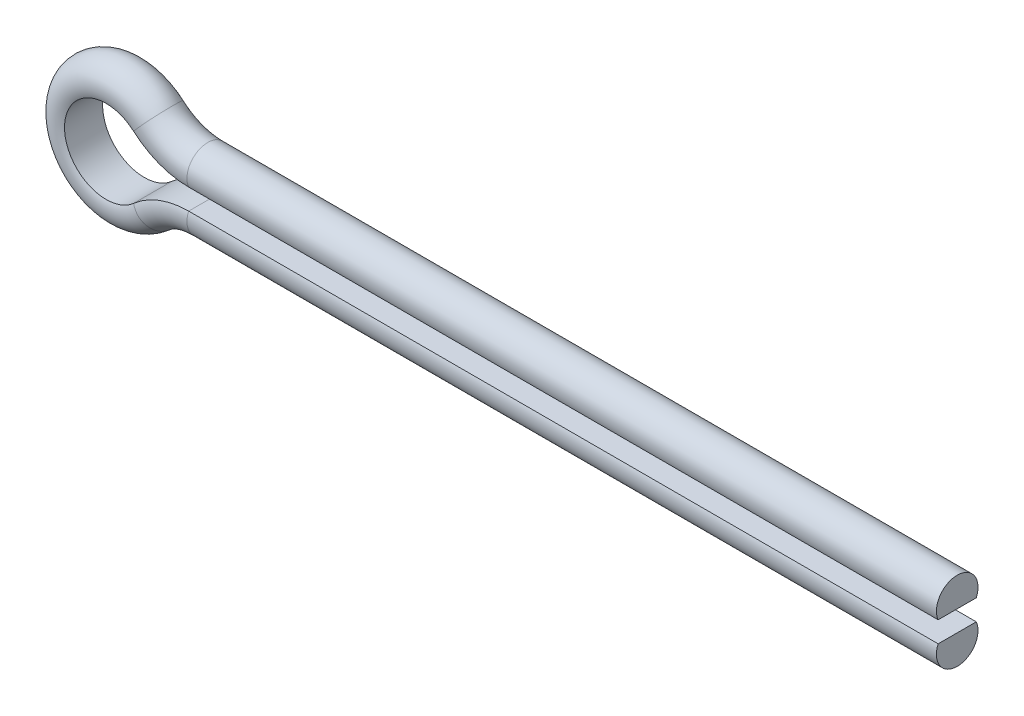
ISO-10303-21;
HEADER;
FILE_DESCRIPTION(('STEP AP214'),'2;1');
FILE_NAME('part.step','',(''),(''),'','','');
FILE_SCHEMA(('AUTOMOTIVE_DESIGN { 1 0 10303 214 1 1 1 1 }'));
ENDSEC;
DATA;
#1=APPLICATION_CONTEXT('core data for automotive mechanical design processes');
#2=APPLICATION_PROTOCOL_DEFINITION('international standard','automotive_design',2000,#1);
#3=PRODUCT_CONTEXT('',#1,'mechanical');
#4=PRODUCT('Part','Part','',(#3));
#5=PRODUCT_RELATED_PRODUCT_CATEGORY('part','',(#4));
#6=PRODUCT_DEFINITION_FORMATION('','',#4);
#7=PRODUCT_DEFINITION_CONTEXT('part definition',#1,'design');
#8=PRODUCT_DEFINITION('design','',#6,#7);
#9=PRODUCT_DEFINITION_SHAPE('','',#8);
#10=(LENGTH_UNIT() NAMED_UNIT(*) SI_UNIT(.MILLI.,.METRE.));
#11=(NAMED_UNIT(*) PLANE_ANGLE_UNIT() SI_UNIT($,.RADIAN.));
#12=(NAMED_UNIT(*) SI_UNIT($,.STERADIAN.) SOLID_ANGLE_UNIT());
#13=UNCERTAINTY_MEASURE_WITH_UNIT(LENGTH_MEASURE(1.E-05),#10,'distance_accuracy_value','');
#14=(GEOMETRIC_REPRESENTATION_CONTEXT(3) GLOBAL_UNCERTAINTY_ASSIGNED_CONTEXT((#13)) GLOBAL_UNIT_ASSIGNED_CONTEXT((#10,
#11,#12)) REPRESENTATION_CONTEXT('',''));
#15=CARTESIAN_POINT('',(0.,0.,0.));
#16=DIRECTION('',(0.,0.,1.));
#17=DIRECTION('',(1.,0.,0.));
#18=AXIS2_PLACEMENT_3D('',#15,#16,#17);
#19=CARTESIAN_POINT('',(100.,2.25,0.));
#20=DIRECTION('',(-1.,0.,0.));
#21=DIRECTION('',(0.,0.,-1.));
#22=AXIS2_PLACEMENT_3D('',#19,#20,#21);
#23=PLANE('',#22);
#24=CARTESIAN_POINT('',(100.,2.25,0.));
#25=DIRECTION('',(-1.,0.,0.));
#26=DIRECTION('',(0.,0.,-1.));
#27=AXIS2_PLACEMENT_3D('',#24,#25,#26);
#28=CIRCLE('',#27,2.5);
#29=CARTESIAN_POINT('',(100.,1.25,2.29128784747792));
#30=VERTEX_POINT('',#29);
#31=CARTESIAN_POINT('',(100.,1.25,-2.29128784747792));
#32=VERTEX_POINT('',#31);
#33=EDGE_CURVE('E79',#30,#32,#28,.T.);
#34=ORIENTED_EDGE('',*,*,#33,.F.);
#35=DIRECTION('',(0.,0.,1.));
#36=VECTOR('',#35,1.);
#37=CARTESIAN_POINT('',(100.,1.25,2.29128784747792));
#38=LINE('',#37,#36);
#39=EDGE_CURVE('E81',#32,#30,#38,.T.);
#40=ORIENTED_EDGE('',*,*,#39,.F.);
#41=EDGE_LOOP('',(#34,#40));
#42=FACE_BOUND('',#41,.T.);
#43=ADVANCED_FACE('F33',(#42),#23,.F.);
#44=CARTESIAN_POINT('',(100.,-2.25,0.));
#45=DIRECTION('',(1.,0.,0.));
#46=DIRECTION('',(0.,0.,-1.));
#47=AXIS2_PLACEMENT_3D('',#44,#45,#46);
#48=PLANE('',#47);
#49=CARTESIAN_POINT('',(100.,-2.25,0.));
#50=DIRECTION('',(1.,0.,0.));
#51=DIRECTION('',(0.,0.,-1.));
#52=AXIS2_PLACEMENT_3D('',#49,#50,#51);
#53=CIRCLE('',#52,2.5);
#54=CARTESIAN_POINT('',(100.,-1.25,2.29128784747792));
#55=VERTEX_POINT('',#54);
#56=CARTESIAN_POINT('',(100.,-1.25,-2.29128784747792));
#57=VERTEX_POINT('',#56);
#58=EDGE_CURVE('E45',#55,#57,#53,.T.);
#59=ORIENTED_EDGE('',*,*,#58,.T.);
#60=DIRECTION('',(0.,0.,1.));
#61=VECTOR('',#60,1.);
#62=CARTESIAN_POINT('',(100.,-1.25,2.29128784747792));
#63=LINE('',#62,#61);
#64=EDGE_CURVE('E11',#57,#55,#63,.T.);
#65=ORIENTED_EDGE('',*,*,#64,.T.);
#66=EDGE_LOOP('',(#59,#65));
#67=FACE_BOUND('',#66,.T.);
#68=ADVANCED_FACE('F184',(#67),#48,.T.);
#69=CARTESIAN_POINT('',(100.,2.25,0.));
#70=DIRECTION('',(-1.,0.,0.));
#71=DIRECTION('',(0.,-1.,0.));
#72=AXIS2_PLACEMENT_3D('',#69,#70,#71);
#73=CYLINDRICAL_SURFACE('',#72,2.5);
#74=DIRECTION('',(-1.,0.,0.));
#75=VECTOR('',#74,1.);
#76=CARTESIAN_POINT('',(100.,1.25,-2.29128784747792));
#77=LINE('',#76,#75);
#78=CARTESIAN_POINT('',(9.92156741649221,1.25,-2.29128784747792));
#79=VERTEX_POINT('',#78);
#80=EDGE_CURVE('E92',#32,#79,#77,.T.);
#81=ORIENTED_EDGE('',*,*,#80,.T.);
#82=CARTESIAN_POINT('',(9.92156741649221,2.25,0.));
#83=DIRECTION('',(-1.,0.,0.));
#84=DIRECTION('',(0.,0.,-1.));
#85=AXIS2_PLACEMENT_3D('',#82,#83,#84);
#86=CIRCLE('',#85,2.5);
#87=CARTESIAN_POINT('',(9.92156741649221,1.25,2.29128784747792));
#88=VERTEX_POINT('',#87);
#89=EDGE_CURVE('E97',#88,#79,#86,.T.);
#90=ORIENTED_EDGE('',*,*,#89,.F.);
#91=DIRECTION('',(-1.,0.,0.));
#92=VECTOR('',#91,1.);
#93=CARTESIAN_POINT('',(100.,1.25,2.29128784747792));
#94=LINE('',#93,#92);
#95=EDGE_CURVE('E91',#30,#88,#94,.T.);
#96=ORIENTED_EDGE('',*,*,#95,.F.);
#97=ORIENTED_EDGE('',*,*,#33,.T.);
#98=EDGE_LOOP('',(#81,#90,#96,#97));
#99=FACE_BOUND('',#98,.T.);
#100=ADVANCED_FACE('F95',(#99),#73,.T.);
#101=CARTESIAN_POINT('',(100.,1.25,2.29128784747792));
#102=DIRECTION('',(0.,-1.,0.));
#103=DIRECTION('',(0.,0.,-1.));
#104=AXIS2_PLACEMENT_3D('',#101,#102,#103);
#105=PLANE('',#104);
#106=DIRECTION('',(0.,0.,1.));
#107=VECTOR('',#106,1.);
#108=CARTESIAN_POINT('',(9.92156741649221,1.25,2.29128784747792));
#109=LINE('',#108,#107);
#110=EDGE_CURVE('E112',#79,#88,#109,.T.);
#111=ORIENTED_EDGE('',*,*,#110,.F.);
#112=ORIENTED_EDGE('',*,*,#80,.F.);
#113=ORIENTED_EDGE('',*,*,#39,.T.);
#114=ORIENTED_EDGE('',*,*,#95,.T.);
#115=EDGE_LOOP('',(#111,#112,#113,#114));
#116=FACE_BOUND('',#115,.T.);
#117=ADVANCED_FACE('F90',(#116),#105,.T.);
#118=CARTESIAN_POINT('',(9.9215674164922,11.25,0.));
#119=DIRECTION('',(0.,0.,-1.));
#120=DIRECTION('',(-1.,0.,0.));
#121=AXIS2_PLACEMENT_3D('',#118,#119,#120);
#122=TOROIDAL_SURFACE('',#121,8.99999999999999,2.5);
#123=CARTESIAN_POINT('',(9.9215674164922,11.25,-2.29128784747792));
#124=DIRECTION('',(0.,0.,-1.));
#125=DIRECTION('',(0.,-1.,0.));
#126=AXIS2_PLACEMENT_3D('',#123,#124,#125);
#127=CIRCLE('',#126,9.99999999999999);
#128=CARTESIAN_POINT('',(3.30718913883073,3.75,-2.29128784747792));
#129=VERTEX_POINT('',#128);
#130=EDGE_CURVE('E105',#79,#129,#127,.T.);
#131=ORIENTED_EDGE('',*,*,#130,.T.);
#132=CARTESIAN_POINT('',(3.96862696659687,4.5,0.));
#133=DIRECTION('',(-0.75,0.661437827766148,0.));
#134=DIRECTION('',(0.,0.,-1.));
#135=AXIS2_PLACEMENT_3D('',#132,#133,#134);
#136=CIRCLE('',#135,2.5);
#137=CARTESIAN_POINT('',(3.30718913883073,3.75,2.29128784747792));
#138=VERTEX_POINT('',#137);
#139=EDGE_CURVE('E102',#138,#129,#136,.T.);
#140=ORIENTED_EDGE('',*,*,#139,.F.);
#141=CARTESIAN_POINT('',(9.9215674164922,11.25,2.29128784747792));
#142=DIRECTION('',(0.,0.,-1.));
#143=DIRECTION('',(0.,-1.,0.));
#144=AXIS2_PLACEMENT_3D('',#141,#142,#143);
#145=CIRCLE('',#144,9.99999999999999);
#146=EDGE_CURVE('E106',#88,#138,#145,.T.);
#147=ORIENTED_EDGE('',*,*,#146,.F.);
#148=ORIENTED_EDGE('',*,*,#89,.T.);
#149=EDGE_LOOP('',(#131,#140,#147,#148));
#150=FACE_BOUND('',#149,.T.);
#151=ADVANCED_FACE('F164',(#150),#122,.T.);
#152=CARTESIAN_POINT('',(9.9215674164922,11.25,0.));
#153=DIRECTION('',(0.,0.,-1.));
#154=DIRECTION('',(-1.,0.,0.));
#155=AXIS2_PLACEMENT_3D('',#152,#153,#154);
#156=CYLINDRICAL_SURFACE('',#155,9.99999999999999);
#157=DIRECTION('',(0.,0.,1.));
#158=VECTOR('',#157,1.);
#159=CARTESIAN_POINT('',(3.30718913883073,3.75,2.29128784747792));
#160=LINE('',#159,#158);
#161=EDGE_CURVE('E109',#129,#138,#160,.T.);
#162=ORIENTED_EDGE('',*,*,#161,.F.);
#163=ORIENTED_EDGE('',*,*,#130,.F.);
#164=ORIENTED_EDGE('',*,*,#110,.T.);
#165=ORIENTED_EDGE('',*,*,#146,.T.);
#166=EDGE_LOOP('',(#162,#163,#164,#165));
#167=FACE_BOUND('',#166,.T.);
#168=ADVANCED_FACE('F165',(#167),#156,.T.);
#169=CARTESIAN_POINT('',(0.,0.,0.));
#170=DIRECTION('',(0.,0.,1.));
#171=DIRECTION('',(1.,0.,0.));
#172=AXIS2_PLACEMENT_3D('',#169,#170,#171);
#173=TOROIDAL_SURFACE('',#172,6.,2.5);
#174=CARTESIAN_POINT('',(0.,0.,-2.29128784747792));
#175=DIRECTION('',(0.,0.,1.));
#176=DIRECTION('',(0.661437827766146,0.750000000000001,0.));
#177=AXIS2_PLACEMENT_3D('',#174,#175,#176);
#178=CIRCLE('',#177,4.99999999999999);
#179=CARTESIAN_POINT('',(3.30718913883072,-3.75,-2.29128784747792));
#180=VERTEX_POINT('',#179);
#181=EDGE_CURVE('E116',#129,#180,#178,.T.);
#182=ORIENTED_EDGE('',*,*,#181,.T.);
#183=CARTESIAN_POINT('',(3.96862696659687,-4.5,0.));
#184=DIRECTION('',(0.75,0.661437827766147,0.));
#185=DIRECTION('',(0.,0.,-1.));
#186=AXIS2_PLACEMENT_3D('',#183,#184,#185);
#187=CIRCLE('',#186,2.5);
#188=CARTESIAN_POINT('',(3.30718913883072,-3.75,2.29128784747792));
#189=VERTEX_POINT('',#188);
#190=EDGE_CURVE('E113',#189,#180,#187,.T.);
#191=ORIENTED_EDGE('',*,*,#190,.F.);
#192=CARTESIAN_POINT('',(0.,0.,2.29128784747792));
#193=DIRECTION('',(0.,0.,1.));
#194=DIRECTION('',(0.661437827766146,0.750000000000001,0.));
#195=AXIS2_PLACEMENT_3D('',#192,#193,#194);
#196=CIRCLE('',#195,4.99999999999999);
#197=EDGE_CURVE('E117',#138,#189,#196,.T.);
#198=ORIENTED_EDGE('',*,*,#197,.F.);
#199=ORIENTED_EDGE('',*,*,#139,.T.);
#200=EDGE_LOOP('',(#182,#191,#198,#199));
#201=FACE_BOUND('',#200,.T.);
#202=ADVANCED_FACE('F158',(#201),#173,.T.);
#203=CARTESIAN_POINT('',(0.,0.,0.));
#204=DIRECTION('',(0.,0.,1.));
#205=DIRECTION('',(1.,0.,0.));
#206=AXIS2_PLACEMENT_3D('',#203,#204,#205);
#207=CYLINDRICAL_SURFACE('',#206,4.99999999999999);
#208=DIRECTION('',(0.,0.,1.));
#209=VECTOR('',#208,1.);
#210=CARTESIAN_POINT('',(3.30718913883073,-3.75,2.29128784747792));
#211=LINE('',#210,#209);
#212=EDGE_CURVE('E120',#180,#189,#211,.T.);
#213=ORIENTED_EDGE('',*,*,#212,.F.);
#214=ORIENTED_EDGE('',*,*,#181,.F.);
#215=ORIENTED_EDGE('',*,*,#161,.T.);
#216=ORIENTED_EDGE('',*,*,#197,.T.);
#217=EDGE_LOOP('',(#213,#214,#215,#216));
#218=FACE_BOUND('',#217,.T.);
#219=ADVANCED_FACE('F159',(#218),#207,.F.);
#220=CARTESIAN_POINT('',(9.9215674164922,-11.25,0.));
#221=DIRECTION('',(0.,0.,-1.));
#222=DIRECTION('',(-1.,0.,0.));
#223=AXIS2_PLACEMENT_3D('',#220,#221,#222);
#224=TOROIDAL_SURFACE('',#223,9.00000000000001,2.5);
#225=CARTESIAN_POINT('',(9.9215674164922,-11.25,-2.29128784747792));
#226=DIRECTION('',(0.,0.,-1.));
#227=DIRECTION('',(-0.661437827766148,0.75,0.));
#228=AXIS2_PLACEMENT_3D('',#225,#226,#227);
#229=CIRCLE('',#228,10.);
#230=CARTESIAN_POINT('',(9.92156741649221,-1.25,-2.29128784747792));
#231=VERTEX_POINT('',#230);
#232=EDGE_CURVE('E126',#180,#231,#229,.T.);
#233=ORIENTED_EDGE('',*,*,#232,.T.);
#234=CARTESIAN_POINT('',(9.92156741649221,-2.25,0.));
#235=DIRECTION('',(1.,0.,0.));
#236=DIRECTION('',(0.,0.,-1.));
#237=AXIS2_PLACEMENT_3D('',#234,#235,#236);
#238=CIRCLE('',#237,2.5);
#239=CARTESIAN_POINT('',(9.92156741649221,-1.25,2.29128784747792));
#240=VERTEX_POINT('',#239);
#241=EDGE_CURVE('E123',#240,#231,#238,.T.);
#242=ORIENTED_EDGE('',*,*,#241,.F.);
#243=CARTESIAN_POINT('',(9.9215674164922,-11.25,2.29128784747792));
#244=DIRECTION('',(0.,0.,-1.));
#245=DIRECTION('',(-0.661437827766148,0.75,0.));
#246=AXIS2_PLACEMENT_3D('',#243,#244,#245);
#247=CIRCLE('',#246,10.);
#248=EDGE_CURVE('E127',#189,#240,#247,.T.);
#249=ORIENTED_EDGE('',*,*,#248,.F.);
#250=ORIENTED_EDGE('',*,*,#190,.T.);
#251=EDGE_LOOP('',(#233,#242,#249,#250));
#252=FACE_BOUND('',#251,.T.);
#253=ADVANCED_FACE('F151',(#252),#224,.T.);
#254=CARTESIAN_POINT('',(9.9215674164922,-11.25,0.));
#255=DIRECTION('',(0.,0.,-1.));
#256=DIRECTION('',(-1.,0.,0.));
#257=AXIS2_PLACEMENT_3D('',#254,#255,#256);
#258=CYLINDRICAL_SURFACE('',#257,10.);
#259=DIRECTION('',(0.,0.,1.));
#260=VECTOR('',#259,1.);
#261=CARTESIAN_POINT('',(9.92156741649221,-1.25,2.29128784747792));
#262=LINE('',#261,#260);
#263=EDGE_CURVE('E130',#231,#240,#262,.T.);
#264=ORIENTED_EDGE('',*,*,#263,.F.);
#265=ORIENTED_EDGE('',*,*,#232,.F.);
#266=ORIENTED_EDGE('',*,*,#212,.T.);
#267=ORIENTED_EDGE('',*,*,#248,.T.);
#268=EDGE_LOOP('',(#264,#265,#266,#267));
#269=FACE_BOUND('',#268,.T.);
#270=ADVANCED_FACE('F153',(#269),#258,.T.);
#271=CARTESIAN_POINT('',(9.92156741649221,-2.25,0.));
#272=DIRECTION('',(1.,0.,0.));
#273=DIRECTION('',(0.,0.,-1.));
#274=AXIS2_PLACEMENT_3D('',#271,#272,#273);
#275=CYLINDRICAL_SURFACE('',#274,2.5);
#276=DIRECTION('',(1.,0.,0.));
#277=VECTOR('',#276,1.);
#278=CARTESIAN_POINT('',(9.92156741649221,-1.25,-2.29128784747792));
#279=LINE('',#278,#277);
#280=EDGE_CURVE('E40',#231,#57,#279,.T.);
#281=ORIENTED_EDGE('',*,*,#280,.T.);
#282=ORIENTED_EDGE('',*,*,#58,.F.);
#283=DIRECTION('',(1.,0.,0.));
#284=VECTOR('',#283,1.);
#285=CARTESIAN_POINT('',(9.92156741649221,-1.25,2.29128784747792));
#286=LINE('',#285,#284);
#287=EDGE_CURVE('E134',#240,#55,#286,.T.);
#288=ORIENTED_EDGE('',*,*,#287,.F.);
#289=ORIENTED_EDGE('',*,*,#241,.T.);
#290=EDGE_LOOP('',(#281,#282,#288,#289));
#291=FACE_BOUND('',#290,.T.);
#292=ADVANCED_FACE('F177',(#291),#275,.T.);
#293=CARTESIAN_POINT('',(9.92156741649221,-1.25,2.29128784747792));
#294=DIRECTION('',(0.,1.,0.));
#295=DIRECTION('',(0.,0.,1.));
#296=AXIS2_PLACEMENT_3D('',#293,#294,#295);
#297=PLANE('',#296);
#298=ORIENTED_EDGE('',*,*,#64,.F.);
#299=ORIENTED_EDGE('',*,*,#280,.F.);
#300=ORIENTED_EDGE('',*,*,#263,.T.);
#301=ORIENTED_EDGE('',*,*,#287,.T.);
#302=EDGE_LOOP('',(#298,#299,#300,#301));
#303=FACE_BOUND('',#302,.T.);
#304=ADVANCED_FACE('F148',(#303),#297,.T.);
#305=CLOSED_SHELL('',(#43,#68,#100,#117,#151,#168,#202,#219,#253,#270,#292,#304));
#306=MANIFOLD_SOLID_BREP('B2',#305);
#307=ADVANCED_BREP_SHAPE_REPRESENTATION('',(#18,#306),#14);
#308=SHAPE_DEFINITION_REPRESENTATION(#9,#307);
ENDSEC;
END-ISO-10303-21;
